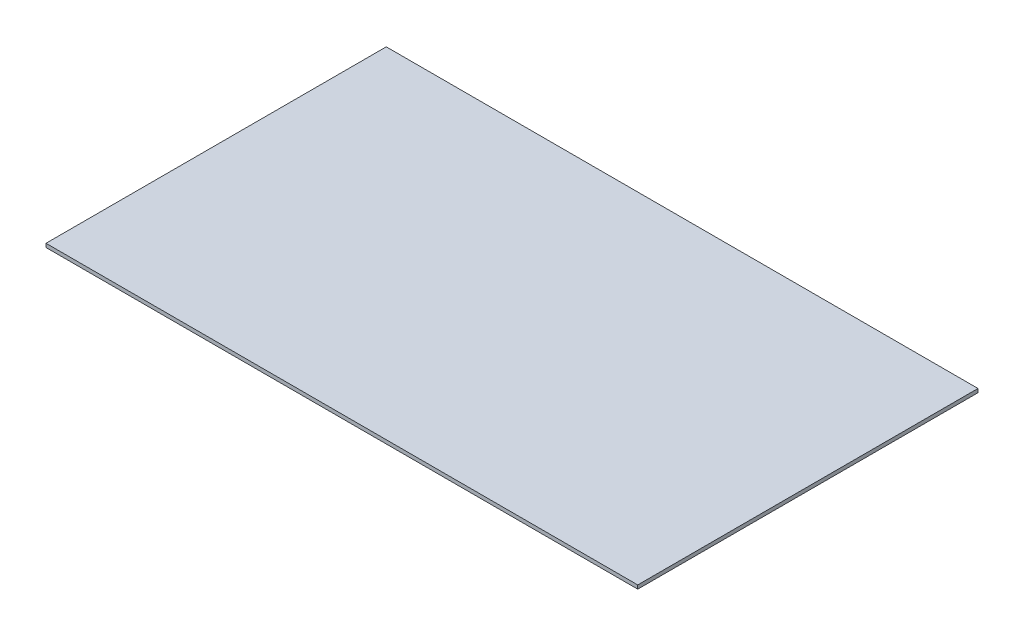
ISO-10303-21;
HEADER;
FILE_DESCRIPTION(('STEP AP214'),'2;1');
FILE_NAME('part.step','',(''),(''),'','','');
FILE_SCHEMA(('AUTOMOTIVE_DESIGN { 1 0 10303 214 1 1 1 1 }'));
ENDSEC;
DATA;
#1=APPLICATION_CONTEXT('core data for automotive mechanical design processes');
#2=APPLICATION_PROTOCOL_DEFINITION('international standard','automotive_design',2000,#1);
#3=PRODUCT_CONTEXT('',#1,'mechanical');
#4=PRODUCT('Part','Part','',(#3));
#5=PRODUCT_RELATED_PRODUCT_CATEGORY('part','',(#4));
#6=PRODUCT_DEFINITION_FORMATION('','',#4);
#7=PRODUCT_DEFINITION_CONTEXT('part definition',#1,'design');
#8=PRODUCT_DEFINITION('design','',#6,#7);
#9=PRODUCT_DEFINITION_SHAPE('','',#8);
#10=(LENGTH_UNIT() NAMED_UNIT(*) SI_UNIT(.MILLI.,.METRE.));
#11=(NAMED_UNIT(*) PLANE_ANGLE_UNIT() SI_UNIT($,.RADIAN.));
#12=(NAMED_UNIT(*) SI_UNIT($,.STERADIAN.) SOLID_ANGLE_UNIT());
#13=UNCERTAINTY_MEASURE_WITH_UNIT(LENGTH_MEASURE(1.E-05),#10,'distance_accuracy_value','');
#14=(GEOMETRIC_REPRESENTATION_CONTEXT(3) GLOBAL_UNCERTAINTY_ASSIGNED_CONTEXT((#13)) GLOBAL_UNIT_ASSIGNED_CONTEXT((#10,
#11,#12)) REPRESENTATION_CONTEXT('',''));
#15=CARTESIAN_POINT('',(0.,0.,0.));
#16=DIRECTION('',(0.,0.,1.));
#17=DIRECTION('',(1.,0.,0.));
#18=AXIS2_PLACEMENT_3D('',#15,#16,#17);
#19=CARTESIAN_POINT('',(-98.6478070175438,1.5875,-73.3452850877193));
#20=DIRECTION('',(1.,0.,0.));
#21=DIRECTION('',(0.,0.,-1.));
#22=AXIS2_PLACEMENT_3D('',#19,#20,#21);
#23=PLANE('',#22);
#24=DIRECTION('',(0.,0.,1.));
#25=VECTOR('',#24,1.);
#26=CARTESIAN_POINT('',(-98.6478070175438,0.,-73.3452850877193));
#27=LINE('',#26,#25);
#28=CARTESIAN_POINT('',(-98.6478070175438,0.,-73.3452850877193));
#29=VERTEX_POINT('',#28);
#30=CARTESIAN_POINT('',(-98.6478070175438,0.,72.7047149122807));
#31=VERTEX_POINT('',#30);
#32=EDGE_CURVE('E102',#29,#31,#27,.T.);
#33=ORIENTED_EDGE('',*,*,#32,.T.);
#34=DIRECTION('',(0.,-1.,0.));
#35=VECTOR('',#34,1.);
#36=CARTESIAN_POINT('',(-98.6478070175438,1.5875,72.7047149122807));
#37=LINE('',#36,#35);
#38=CARTESIAN_POINT('',(-98.6478070175438,1.5875,72.7047149122807));
#39=VERTEX_POINT('',#38);
#40=EDGE_CURVE('E11',#39,#31,#37,.T.);
#41=ORIENTED_EDGE('',*,*,#40,.F.);
#42=DIRECTION('',(0.,0.,1.));
#43=VECTOR('',#42,1.);
#44=CARTESIAN_POINT('',(-98.6478070175438,1.5875,-73.3452850877193));
#45=LINE('',#44,#43);
#46=CARTESIAN_POINT('',(-98.6478070175438,1.5875,-73.3452850877193));
#47=VERTEX_POINT('',#46);
#48=EDGE_CURVE('E90',#47,#39,#45,.T.);
#49=ORIENTED_EDGE('',*,*,#48,.F.);
#50=DIRECTION('',(0.,-1.,0.));
#51=VECTOR('',#50,1.);
#52=CARTESIAN_POINT('',(-98.6478070175438,1.5875,-73.3452850877193));
#53=LINE('',#52,#51);
#54=EDGE_CURVE('E98',#47,#29,#53,.T.);
#55=ORIENTED_EDGE('',*,*,#54,.T.);
#56=EDGE_LOOP('',(#33,#41,#49,#55));
#57=FACE_BOUND('',#56,.T.);
#58=ADVANCED_FACE('F39',(#57),#23,.F.);
#59=CARTESIAN_POINT('',(-98.6478070175438,1.5875,72.7047149122807));
#60=DIRECTION('',(0.,0.,-1.));
#61=DIRECTION('',(-1.,0.,0.));
#62=AXIS2_PLACEMENT_3D('',#59,#60,#61);
#63=PLANE('',#62);
#64=DIRECTION('',(1.,0.,0.));
#65=VECTOR('',#64,1.);
#66=CARTESIAN_POINT('',(-98.6478070175438,0.,72.7047149122807));
#67=LINE('',#66,#65);
#68=CARTESIAN_POINT('',(155.352192982456,0.,72.7047149122807));
#69=VERTEX_POINT('',#68);
#70=EDGE_CURVE('E94',#31,#69,#67,.T.);
#71=ORIENTED_EDGE('',*,*,#70,.T.);
#72=DIRECTION('',(0.,-1.,0.));
#73=VECTOR('',#72,1.);
#74=CARTESIAN_POINT('',(155.352192982456,1.5875,72.7047149122807));
#75=LINE('',#74,#73);
#76=CARTESIAN_POINT('',(155.352192982456,1.5875,72.7047149122807));
#77=VERTEX_POINT('',#76);
#78=EDGE_CURVE('E47',#77,#69,#75,.T.);
#79=ORIENTED_EDGE('',*,*,#78,.F.);
#80=DIRECTION('',(1.,0.,0.));
#81=VECTOR('',#80,1.);
#82=CARTESIAN_POINT('',(-98.6478070175438,1.5875,72.7047149122807));
#83=LINE('',#82,#81);
#84=EDGE_CURVE('E85',#39,#77,#83,.T.);
#85=ORIENTED_EDGE('',*,*,#84,.F.);
#86=ORIENTED_EDGE('',*,*,#40,.T.);
#87=EDGE_LOOP('',(#71,#79,#85,#86));
#88=FACE_BOUND('',#87,.T.);
#89=ADVANCED_FACE('F93',(#88),#63,.F.);
#90=CARTESIAN_POINT('',(155.352192982456,1.5875,-73.3452850877193));
#91=DIRECTION('',(-1.,0.,0.));
#92=DIRECTION('',(0.,0.,1.));
#93=AXIS2_PLACEMENT_3D('',#90,#91,#92);
#94=PLANE('',#93);
#95=DIRECTION('',(0.,0.,-1.));
#96=VECTOR('',#95,1.);
#97=CARTESIAN_POINT('',(155.352192982456,0.,-73.3452850877193));
#98=LINE('',#97,#96);
#99=CARTESIAN_POINT('',(155.352192982456,0.,-73.3452850877193));
#100=VERTEX_POINT('',#99);
#101=EDGE_CURVE('E72',#69,#100,#98,.T.);
#102=ORIENTED_EDGE('',*,*,#101,.T.);
#103=DIRECTION('',(0.,-1.,0.));
#104=VECTOR('',#103,1.);
#105=CARTESIAN_POINT('',(155.352192982456,1.5875,-73.3452850877193));
#106=LINE('',#105,#104);
#107=CARTESIAN_POINT('',(155.352192982456,1.5875,-73.3452850877193));
#108=VERTEX_POINT('',#107);
#109=EDGE_CURVE('E95',#108,#100,#106,.T.);
#110=ORIENTED_EDGE('',*,*,#109,.F.);
#111=DIRECTION('',(0.,0.,-1.));
#112=VECTOR('',#111,1.);
#113=CARTESIAN_POINT('',(155.352192982456,1.5875,-73.3452850877193));
#114=LINE('',#113,#112);
#115=EDGE_CURVE('E88',#77,#108,#114,.T.);
#116=ORIENTED_EDGE('',*,*,#115,.F.);
#117=ORIENTED_EDGE('',*,*,#78,.T.);
#118=EDGE_LOOP('',(#102,#110,#116,#117));
#119=FACE_BOUND('',#118,.T.);
#120=ADVANCED_FACE('F96',(#119),#94,.F.);
#121=CARTESIAN_POINT('',(-98.6478070175438,1.5875,-73.3452850877193));
#122=DIRECTION('',(0.,0.,1.));
#123=DIRECTION('',(1.,0.,0.));
#124=AXIS2_PLACEMENT_3D('',#121,#122,#123);
#125=PLANE('',#124);
#126=DIRECTION('',(-1.,0.,0.));
#127=VECTOR('',#126,1.);
#128=CARTESIAN_POINT('',(-98.6478070175438,0.,-73.3452850877193));
#129=LINE('',#128,#127);
#130=EDGE_CURVE('E78',#100,#29,#129,.T.);
#131=ORIENTED_EDGE('',*,*,#130,.T.);
#132=ORIENTED_EDGE('',*,*,#54,.F.);
#133=DIRECTION('',(-1.,0.,0.));
#134=VECTOR('',#133,1.);
#135=CARTESIAN_POINT('',(-98.6478070175438,1.5875,-73.3452850877193));
#136=LINE('',#135,#134);
#137=EDGE_CURVE('E55',#108,#47,#136,.T.);
#138=ORIENTED_EDGE('',*,*,#137,.F.);
#139=ORIENTED_EDGE('',*,*,#109,.T.);
#140=EDGE_LOOP('',(#131,#132,#138,#139));
#141=FACE_BOUND('',#140,.T.);
#142=ADVANCED_FACE('F109',(#141),#125,.F.);
#143=CARTESIAN_POINT('',(0.,1.5875,0.));
#144=DIRECTION('',(0.,1.,0.));
#145=DIRECTION('',(0.,0.,1.));
#146=AXIS2_PLACEMENT_3D('',#143,#144,#145);
#147=PLANE('',#146);
#148=ORIENTED_EDGE('',*,*,#48,.T.);
#149=ORIENTED_EDGE('',*,*,#84,.T.);
#150=ORIENTED_EDGE('',*,*,#115,.T.);
#151=ORIENTED_EDGE('',*,*,#137,.T.);
#152=EDGE_LOOP('',(#148,#149,#150,#151));
#153=FACE_BOUND('',#152,.T.);
#154=ADVANCED_FACE('F86',(#153),#147,.T.);
#155=CARTESIAN_POINT('',(0.,0.,0.));
#156=DIRECTION('',(0.,1.,0.));
#157=DIRECTION('',(0.,0.,1.));
#158=AXIS2_PLACEMENT_3D('',#155,#156,#157);
#159=PLANE('',#158);
#160=ORIENTED_EDGE('',*,*,#32,.F.);
#161=ORIENTED_EDGE('',*,*,#130,.F.);
#162=ORIENTED_EDGE('',*,*,#101,.F.);
#163=ORIENTED_EDGE('',*,*,#70,.F.);
#164=EDGE_LOOP('',(#160,#161,#162,#163));
#165=FACE_BOUND('',#164,.T.);
#166=ADVANCED_FACE('F112',(#165),#159,.F.);
#167=CLOSED_SHELL('',(#58,#89,#120,#142,#154,#166));
#168=MANIFOLD_SOLID_BREP('B2',#167);
#169=ADVANCED_BREP_SHAPE_REPRESENTATION('',(#18,#168),#14);
#170=SHAPE_DEFINITION_REPRESENTATION(#9,#169);
ENDSEC;
END-ISO-10303-21;
